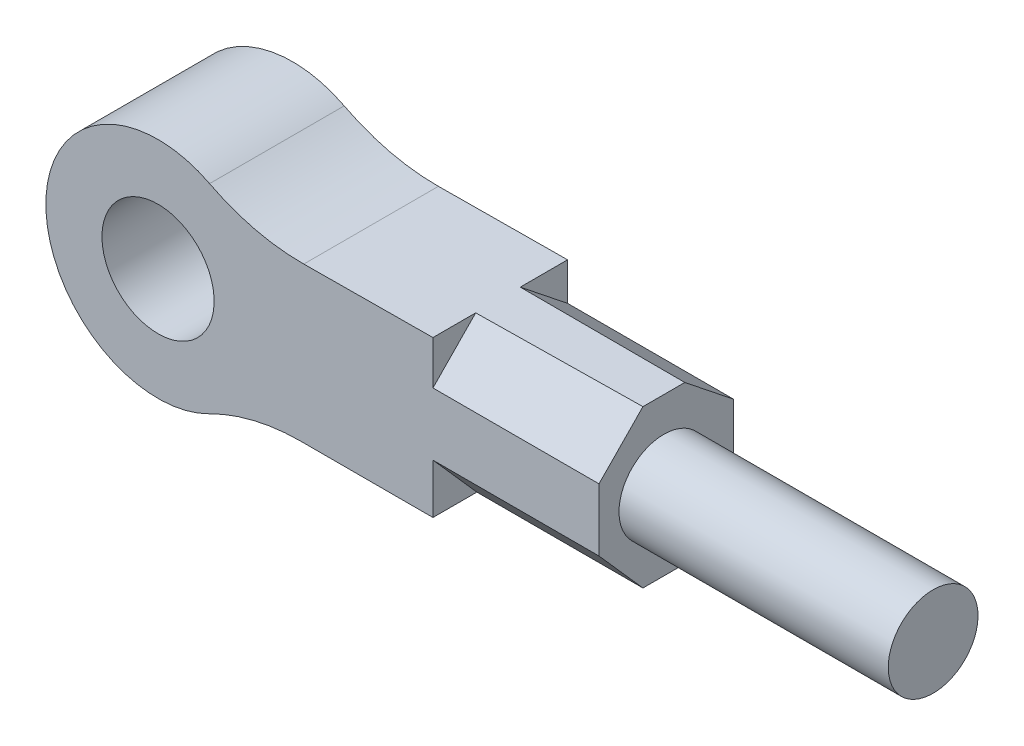
ISO-10303-21;
HEADER;
FILE_DESCRIPTION(('STEP AP214'),'2;1');
FILE_NAME('part.step','',(''),(''),'','','');
FILE_SCHEMA(('AUTOMOTIVE_DESIGN { 1 0 10303 214 1 1 1 1 }'));
ENDSEC;
DATA;
#1=APPLICATION_CONTEXT('core data for automotive mechanical design processes');
#2=APPLICATION_PROTOCOL_DEFINITION('international standard','automotive_design',2000,#1);
#3=PRODUCT_CONTEXT('',#1,'mechanical');
#4=PRODUCT('Part','Part','',(#3));
#5=PRODUCT_RELATED_PRODUCT_CATEGORY('part','',(#4));
#6=PRODUCT_DEFINITION_FORMATION('','',#4);
#7=PRODUCT_DEFINITION_CONTEXT('part definition',#1,'design');
#8=PRODUCT_DEFINITION('design','',#6,#7);
#9=PRODUCT_DEFINITION_SHAPE('','',#8);
#10=(LENGTH_UNIT() NAMED_UNIT(*) SI_UNIT(.MILLI.,.METRE.));
#11=(NAMED_UNIT(*) PLANE_ANGLE_UNIT() SI_UNIT($,.RADIAN.));
#12=(NAMED_UNIT(*) SI_UNIT($,.STERADIAN.) SOLID_ANGLE_UNIT());
#13=UNCERTAINTY_MEASURE_WITH_UNIT(LENGTH_MEASURE(1.E-05),#10,'distance_accuracy_value','');
#14=(GEOMETRIC_REPRESENTATION_CONTEXT(3) GLOBAL_UNCERTAINTY_ASSIGNED_CONTEXT((#13)) GLOBAL_UNIT_ASSIGNED_CONTEXT((#10,
#11,#12)) REPRESENTATION_CONTEXT('',''));
#15=CARTESIAN_POINT('',(0.,0.,0.));
#16=DIRECTION('',(0.,0.,1.));
#17=DIRECTION('',(1.,0.,0.));
#18=AXIS2_PLACEMENT_3D('',#15,#16,#17);
#19=CARTESIAN_POINT('',(0.,-34.6739639058458,60.));
#20=DIRECTION('',(0.,1.,0.));
#21=DIRECTION('',(0.,0.,1.));
#22=AXIS2_PLACEMENT_3D('',#19,#20,#21);
#23=PLANE('',#22);
#24=DIRECTION('',(0.999999998559959,0.,-5.36663966134042E-05));
#25=VECTOR('',#24,1.);
#26=CARTESIAN_POINT('',(-0.00105023967818376,-34.6739639058458,40.4302181076742));
#27=LINE('',#26,#25);
#28=CARTESIAN_POINT('',(122.511673572301,-34.6739639058458,40.4236432912385));
#29=VERTEX_POINT('',#28);
#30=CARTESIAN_POINT('',(196.511673708677,-34.6739639058458,40.419671977876));
#31=VERTEX_POINT('',#30);
#32=EDGE_CURVE('E205',#29,#31,#27,.T.);
#33=ORIENTED_EDGE('',*,*,#32,.F.);
#34=DIRECTION('',(0.,0.,-1.));
#35=VECTOR('',#34,1.);
#36=CARTESIAN_POINT('',(122.511673572301,-34.6739639058458,60.));
#37=LINE('',#36,#35);
#38=CARTESIAN_POINT('',(122.511673572301,-34.6739639058458,60.));
#39=VERTEX_POINT('',#38);
#40=EDGE_CURVE('E203',#39,#29,#37,.T.);
#41=ORIENTED_EDGE('',*,*,#40,.F.);
#42=DIRECTION('',(1.,0.,0.));
#43=VECTOR('',#42,1.);
#44=CARTESIAN_POINT('',(0.,-34.6739639058458,60.));
#45=LINE('',#44,#43);
#46=CARTESIAN_POINT('',(63.6898949913082,-34.6739639058458,60.));
#47=VERTEX_POINT('',#46);
#48=EDGE_CURVE('E217',#47,#39,#45,.T.);
#49=ORIENTED_EDGE('',*,*,#48,.F.);
#50=DIRECTION('',(0.,0.,-1.));
#51=VECTOR('',#50,1.);
#52=CARTESIAN_POINT('',(63.6898949913082,-34.6739639058458,60.));
#53=LINE('',#52,#51);
#54=CARTESIAN_POINT('',(63.6898949913082,-34.6739639058458,0.));
#55=VERTEX_POINT('',#54);
#56=EDGE_CURVE('E253',#47,#55,#53,.T.);
#57=ORIENTED_EDGE('',*,*,#56,.T.);
#58=DIRECTION('',(1.,0.,0.));
#59=VECTOR('',#58,1.);
#60=CARTESIAN_POINT('',(0.,-34.6739639058458,0.));
#61=LINE('',#60,#59);
#62=CARTESIAN_POINT('',(122.511673572301,-34.6739639058458,0.));
#63=VERTEX_POINT('',#62);
#64=EDGE_CURVE('E236',#55,#63,#61,.T.);
#65=ORIENTED_EDGE('',*,*,#64,.T.);
#66=DIRECTION('',(0.,0.,-1.));
#67=VECTOR('',#66,1.);
#68=CARTESIAN_POINT('',(122.511673572301,-34.6739639058458,60.));
#69=LINE('',#68,#67);
#70=CARTESIAN_POINT('',(122.511673572301,-34.6739639058458,18.4861965025552));
#71=VERTEX_POINT('',#70);
#72=EDGE_CURVE('E143',#71,#63,#69,.T.);
#73=ORIENTED_EDGE('',*,*,#72,.F.);
#74=DIRECTION('',(-0.999999998157082,0.,-6.0711079798287E-05));
#75=VECTOR('',#74,1.);
#76=CARTESIAN_POINT('',(0.00252079939005911,-34.6739639058458,18.4787588395914));
#77=LINE('',#76,#75);
#78=CARTESIAN_POINT('',(196.511673708677,-34.6739639058458,18.4906891224768));
#79=VERTEX_POINT('',#78);
#80=EDGE_CURVE('E154',#79,#71,#77,.T.);
#81=ORIENTED_EDGE('',*,*,#80,.F.);
#82=DIRECTION('',(0.,0.,-1.));
#83=VECTOR('',#82,1.);
#84=CARTESIAN_POINT('',(196.511673708677,-34.6739639058458,60.));
#85=LINE('',#84,#83);
#86=EDGE_CURVE('E250',#31,#79,#85,.T.);
#87=ORIENTED_EDGE('',*,*,#86,.F.);
#88=EDGE_LOOP('',(#33,#41,#49,#57,#65,#73,#81,#87));
#89=FACE_BOUND('',#88,.T.);
#90=ADVANCED_FACE('F35',(#89),#23,.F.);
#91=CARTESIAN_POINT('',(196.509567890578,0.011930308101305,60.));
#92=DIRECTION('',(0.999999998157082,6.07110799101727E-05,0.));
#93=DIRECTION('',(-6.07110799101727E-05,0.999999998157083,0.));
#94=AXIS2_PLACEMENT_3D('',#91,#92,#93);
#95=PLANE('',#94);
#96=CARTESIAN_POINT('',(196.509567890578,0.011930308101305,31.0896388996472));
#97=DIRECTION('',(0.999999998157082,6.07110799101727E-05,0.));
#98=DIRECTION('',(-6.07110799101727E-05,0.999999998157082,0.));
#99=AXIS2_PLACEMENT_3D('',#96,#97,#98);
#100=CIRCLE('',#99,20.);
#101=CARTESIAN_POINT('',(196.50835366898,20.011930271243,31.0896388996472));
#102=VERTEX_POINT('',#101);
#103=EDGE_CURVE('E11',#102,#102,#100,.T.);
#104=ORIENTED_EDGE('',*,*,#103,.F.);
#105=EDGE_LOOP('',(#104));
#106=FACE_BOUND('',#105,.T.);
#107=DIRECTION('',(3.78351369634586E-05,-0.623199866476116,-0.782062609381534));
#108=VECTOR('',#107,1.);
#109=CARTESIAN_POINT('',(196.508900453848,11.0055863176969,-8.76048145037248));
#110=LINE('',#109,#108);
#111=CARTESIAN_POINT('',(196.507423933084,35.32603596515,21.7596058214183));
#112=VERTEX_POINT('',#111);
#113=CARTESIAN_POINT('',(196.508476633541,17.9865246781896,0.));
#114=VERTEX_POINT('',#113);
#115=EDGE_CURVE('E173',#112,#114,#110,.T.);
#116=ORIENTED_EDGE('',*,*,#115,.F.);
#117=DIRECTION('',(0.,0.,-1.));
#118=VECTOR('',#117,1.);
#119=CARTESIAN_POINT('',(196.507423933083,35.32603596515,60.));
#120=LINE('',#119,#118);
#121=CARTESIAN_POINT('',(196.507423933084,35.32603596515,40.419671977876));
#122=VERTEX_POINT('',#121);
#123=EDGE_CURVE('E247',#122,#112,#120,.T.);
#124=ORIENTED_EDGE('',*,*,#123,.F.);
#125=DIRECTION('',(4.33819581567323E-05,-0.714564098365161,0.699569973230405));
#126=VECTOR('',#125,1.);
#127=CARTESIAN_POINT('',(196.507291956634,37.4998804943688,38.2914425263937));
#128=LINE('',#127,#126);
#129=CARTESIAN_POINT('',(196.508638154682,15.3260360020083,60.));
#130=VERTEX_POINT('',#129);
#131=EDGE_CURVE('E179',#122,#130,#128,.T.);
#132=ORIENTED_EDGE('',*,*,#131,.T.);
#133=DIRECTION('',(6.07110799101727E-05,-0.999999998157082,0.));
#134=VECTOR('',#133,1.);
#135=CARTESIAN_POINT('',(196.509567890578,0.011930308101305,60.));
#136=LINE('',#135,#134);
#137=CARTESIAN_POINT('',(196.510328921861,-12.5233644557039,60.));
#138=VERTEX_POINT('',#137);
#139=EDGE_CURVE('E220',#130,#138,#136,.T.);
#140=ORIENTED_EDGE('',*,*,#139,.T.);
#141=DIRECTION('',(4.54870958576141E-05,-0.749238785424287,-0.662299962514617));
#142=VECTOR('',#141,1.);
#143=CARTESIAN_POINT('',(196.511709276397,-35.2598161052679,39.9017998424972));
#144=LINE('',#143,#142);
#145=EDGE_CURVE('E163',#138,#31,#144,.T.);
#146=ORIENTED_EDGE('',*,*,#145,.T.);
#147=ORIENTED_EDGE('',*,*,#86,.T.);
#148=DIRECTION('',(-4.29292162976357E-05,0.707106779883409,-0.707106781186546));
#149=VECTOR('',#148,1.);
#150=CARTESIAN_POINT('',(196.510059504775,-8.08567225467219,-8.09760257769674));
#151=LINE('',#150,#149);
#152=CARTESIAN_POINT('',(196.510551118972,-16.1832748174458,0.));
#153=VERTEX_POINT('',#152);
#154=EDGE_CURVE('E155',#79,#153,#151,.T.);
#155=ORIENTED_EDGE('',*,*,#154,.T.);
#156=DIRECTION('',(6.07110799101727E-05,-0.999999998157082,0.));
#157=VECTOR('',#156,1.);
#158=CARTESIAN_POINT('',(196.509567890578,0.011930308101305,0.));
#159=LINE('',#158,#157);
#160=EDGE_CURVE('E162',#114,#153,#159,.T.);
#161=ORIENTED_EDGE('',*,*,#160,.F.);
#162=EDGE_LOOP('',(#116,#124,#132,#140,#146,#147,#155,#161));
#163=FACE_BOUND('',#162,.T.);
#164=ADVANCED_FACE('F290',(#106,#163),#95,.T.);
#165=CARTESIAN_POINT('',(-0.247026407184308,33.8919630896264,60.));
#166=DIRECTION('',(-0.00728844904140236,0.999973438902539,0.));
#167=DIRECTION('',(-0.99997343890254,-0.00728844904140236,0.));
#168=AXIS2_PLACEMENT_3D('',#165,#166,#167);
#169=PLANE('',#168);
#170=DIRECTION('',(0.999932308306415,0.00728814925518582,0.00906982278980949));
#171=VECTOR('',#170,1.);
#172=CARTESIAN_POINT('',(0.115969066376734,33.8946088339116,19.9782495453212));
#173=LINE('',#172,#171);
#174=CARTESIAN_POINT('',(122.507456541794,34.7866766477778,21.0883937952489));
#175=VERTEX_POINT('',#174);
#176=EDGE_CURVE('E197',#175,#112,#173,.T.);
#177=ORIENTED_EDGE('',*,*,#176,.F.);
#178=DIRECTION('',(0.,0.,-1.));
#179=VECTOR('',#178,1.);
#180=CARTESIAN_POINT('',(122.507456541794,34.7866766477777,60.));
#181=LINE('',#180,#179);
#182=CARTESIAN_POINT('',(122.507456541794,34.7866766477777,0.));
#183=VERTEX_POINT('',#182);
#184=EDGE_CURVE('E194',#175,#183,#181,.T.);
#185=ORIENTED_EDGE('',*,*,#184,.T.);
#186=DIRECTION('',(0.99997343890254,0.00728844904140236,0.));
#187=VECTOR('',#186,1.);
#188=CARTESIAN_POINT('',(-0.247026407184308,33.8919630896264,0.));
#189=LINE('',#188,#187);
#190=CARTESIAN_POINT('',(64.9475486896938,34.3671430492971,0.));
#191=VERTEX_POINT('',#190);
#192=EDGE_CURVE('E239',#191,#183,#189,.T.);
#193=ORIENTED_EDGE('',*,*,#192,.F.);
#194=DIRECTION('',(0.,0.,-1.));
#195=VECTOR('',#194,1.);
#196=CARTESIAN_POINT('',(64.9475486896938,34.3671430492971,60.));
#197=LINE('',#196,#195);
#198=CARTESIAN_POINT('',(64.9475486896938,34.3671430492971,60.));
#199=VERTEX_POINT('',#198);
#200=EDGE_CURVE('E245',#199,#191,#197,.T.);
#201=ORIENTED_EDGE('',*,*,#200,.F.);
#202=DIRECTION('',(0.99997343890254,0.00728844904140236,0.));
#203=VECTOR('',#202,1.);
#204=CARTESIAN_POINT('',(-0.247026407184308,33.8919630896264,60.));
#205=LINE('',#204,#203);
#206=CARTESIAN_POINT('',(122.507456541794,34.7866766477777,60.));
#207=VERTEX_POINT('',#206);
#208=EDGE_CURVE('E223',#199,#207,#205,.T.);
#209=ORIENTED_EDGE('',*,*,#208,.T.);
#210=DIRECTION('',(0.,0.,-1.));
#211=VECTOR('',#210,1.);
#212=CARTESIAN_POINT('',(122.507456541794,34.7866766477777,60.));
#213=LINE('',#212,#211);
#214=CARTESIAN_POINT('',(122.507456541794,34.7866766477777,40.9433152480589));
#215=VERTEX_POINT('',#214);
#216=EDGE_CURVE('E59',#207,#215,#213,.T.);
#217=ORIENTED_EDGE('',*,*,#216,.T.);
#218=DIRECTION('',(0.999948405084847,0.00728826657885139,-0.00707589842687326));
#219=VECTOR('',#218,1.);
#220=CARTESIAN_POINT('',(-0.375716502609793,33.8910251135101,41.8128689634431));
#221=LINE('',#220,#219);
#222=EDGE_CURVE('E200',#215,#122,#221,.T.);
#223=ORIENTED_EDGE('',*,*,#222,.T.);
#224=ORIENTED_EDGE('',*,*,#123,.T.);
#225=EDGE_LOOP('',(#177,#185,#193,#201,#209,#217,#223,#224));
#226=FACE_BOUND('',#225,.T.);
#227=ADVANCED_FACE('F281',(#226),#169,.T.);
#228=CARTESIAN_POINT('',(0.,0.,60.));
#229=DIRECTION('',(0.,0.,1.));
#230=DIRECTION('',(1.,0.,0.));
#231=AXIS2_PLACEMENT_3D('',#228,#229,#230);
#232=PLANE('',#231);
#233=CARTESIAN_POINT('',(0.,0.,60.));
#234=DIRECTION('',(0.,0.,1.));
#235=DIRECTION('',(1.,0.,0.));
#236=AXIS2_PLACEMENT_3D('',#233,#234,#235);
#237=CIRCLE('',#236,25.);
#238=CARTESIAN_POINT('',(-25.,0.,60.));
#239=VERTEX_POINT('',#238);
#240=EDGE_CURVE('E208',#239,#239,#237,.T.);
#241=ORIENTED_EDGE('',*,*,#240,.F.);
#242=EDGE_LOOP('',(#241));
#243=FACE_BOUND('',#242,.T.);
#244=DIRECTION('',(6.0711079910233E-05,-0.999999998157083,0.));
#245=VECTOR('',#244,1.);
#246=CARTESIAN_POINT('',(122.509568026954,0.00743768818796402,60.));
#247=LINE('',#246,#245);
#248=CARTESIAN_POINT('',(122.510329058237,-12.5278570756172,60.));
#249=VERTEX_POINT('',#248);
#250=EDGE_CURVE('E181',#249,#39,#247,.T.);
#251=ORIENTED_EDGE('',*,*,#250,.F.);
#252=DIRECTION('',(0.999999998157082,6.07110799101727E-05,0.));
#253=VECTOR('',#252,1.);
#254=CARTESIAN_POINT('',(122.510329058237,-12.5278570756172,60.));
#255=LINE('',#254,#253);
#256=EDGE_CURVE('E177',#249,#138,#255,.T.);
#257=ORIENTED_EDGE('',*,*,#256,.T.);
#258=ORIENTED_EDGE('',*,*,#139,.F.);
#259=DIRECTION('',(0.999999998157082,6.07110799101727E-05,0.));
#260=VECTOR('',#259,1.);
#261=CARTESIAN_POINT('',(122.508638291058,15.321543382095,60.));
#262=LINE('',#261,#260);
#263=CARTESIAN_POINT('',(122.508638291058,15.321543382095,60.));
#264=VERTEX_POINT('',#263);
#265=EDGE_CURVE('E188',#264,#130,#262,.T.);
#266=ORIENTED_EDGE('',*,*,#265,.F.);
#267=DIRECTION('',(-6.0711079910233E-05,0.999999998157083,0.));
#268=VECTOR('',#267,1.);
#269=CARTESIAN_POINT('',(122.509568026954,0.00743768818795956,60.));
#270=LINE('',#269,#268);
#271=EDGE_CURVE('E39',#264,#207,#270,.T.);
#272=ORIENTED_EDGE('',*,*,#271,.T.);
#273=ORIENTED_EDGE('',*,*,#208,.F.);
#274=CARTESIAN_POINT('',(64.2915882759676,124.364752550526,60.));
#275=DIRECTION('',(0.,0.,1.));
#276=DIRECTION('',(1.,0.,0.));
#277=AXIS2_PLACEMENT_3D('',#274,#275,#276);
#278=CIRCLE('',#277,90.);
#279=CARTESIAN_POINT('',(22.9612815271313,44.4159830537592,60.));
#280=VERTEX_POINT('',#279);
#281=EDGE_CURVE('E226',#199,#280,#278,.F.);
#282=ORIENTED_EDGE('',*,*,#281,.T.);
#283=CARTESIAN_POINT('',(0.,0.,60.));
#284=DIRECTION('',(0.,0.,1.));
#285=DIRECTION('',(1.,0.,0.));
#286=AXIS2_PLACEMENT_3D('',#283,#284,#285);
#287=CIRCLE('',#286,50.);
#288=CARTESIAN_POINT('',(22.7463910683243,-44.5264156806592,60.));
#289=VERTEX_POINT('',#288);
#290=EDGE_CURVE('E211',#280,#289,#287,.T.);
#291=ORIENTED_EDGE('',*,*,#290,.T.);
#292=CARTESIAN_POINT('',(63.6898949913082,-124.673963905846,60.));
#293=DIRECTION('',(0.,0.,1.));
#294=DIRECTION('',(1.,0.,0.));
#295=AXIS2_PLACEMENT_3D('',#292,#293,#294);
#296=CIRCLE('',#295,90.);
#297=EDGE_CURVE('E215',#289,#47,#296,.F.);
#298=ORIENTED_EDGE('',*,*,#297,.T.);
#299=ORIENTED_EDGE('',*,*,#48,.T.);
#300=EDGE_LOOP('',(#251,#257,#258,#266,#272,#273,#282,#291,#298,#299));
#301=FACE_BOUND('',#300,.T.);
#302=ADVANCED_FACE('F274',(#243,#301),#232,.T.);
#303=CARTESIAN_POINT('',(0.,0.,0.));
#304=DIRECTION('',(0.,0.,1.));
#305=DIRECTION('',(1.,0.,0.));
#306=AXIS2_PLACEMENT_3D('',#303,#304,#305);
#307=PLANE('',#306);
#308=CARTESIAN_POINT('',(0.,0.,0.));
#309=DIRECTION('',(0.,0.,1.));
#310=DIRECTION('',(1.,0.,0.));
#311=AXIS2_PLACEMENT_3D('',#308,#309,#310);
#312=CIRCLE('',#311,25.);
#313=CARTESIAN_POINT('',(-25.,0.,0.));
#314=VERTEX_POINT('',#313);
#315=EDGE_CURVE('E207',#314,#314,#312,.T.);
#316=ORIENTED_EDGE('',*,*,#315,.T.);
#317=EDGE_LOOP('',(#316));
#318=FACE_BOUND('',#317,.T.);
#319=DIRECTION('',(-6.0711079910233E-05,0.999999998157083,0.));
#320=VECTOR('',#319,1.);
#321=CARTESIAN_POINT('',(122.509568026954,0.00743768818796402,0.));
#322=LINE('',#321,#320);
#323=CARTESIAN_POINT('',(122.508476769917,17.9820320582763,0.));
#324=VERTEX_POINT('',#323);
#325=EDGE_CURVE('E172',#324,#183,#322,.T.);
#326=ORIENTED_EDGE('',*,*,#325,.F.);
#327=DIRECTION('',(0.999999998157082,6.07110799101727E-05,0.));
#328=VECTOR('',#327,1.);
#329=CARTESIAN_POINT('',(122.508476769917,17.9820320582763,0.));
#330=LINE('',#329,#328);
#331=EDGE_CURVE('E175',#324,#114,#330,.T.);
#332=ORIENTED_EDGE('',*,*,#331,.T.);
#333=ORIENTED_EDGE('',*,*,#160,.T.);
#334=DIRECTION('',(0.999999998157082,6.07110799101727E-05,0.));
#335=VECTOR('',#334,1.);
#336=CARTESIAN_POINT('',(122.510551255348,-16.1877674373591,0.));
#337=LINE('',#336,#335);
#338=CARTESIAN_POINT('',(122.510551255348,-16.1877674373591,0.));
#339=VERTEX_POINT('',#338);
#340=EDGE_CURVE('E151',#339,#153,#337,.T.);
#341=ORIENTED_EDGE('',*,*,#340,.F.);
#342=DIRECTION('',(-6.0711079910233E-05,0.999999998157083,0.));
#343=VECTOR('',#342,1.);
#344=CARTESIAN_POINT('',(122.509568026954,0.00743768818795956,0.));
#345=LINE('',#344,#343);
#346=EDGE_CURVE('E138',#63,#339,#345,.T.);
#347=ORIENTED_EDGE('',*,*,#346,.F.);
#348=ORIENTED_EDGE('',*,*,#64,.F.);
#349=CARTESIAN_POINT('',(63.6898949913082,-124.673963905846,0.));
#350=DIRECTION('',(0.,0.,1.));
#351=DIRECTION('',(1.,0.,0.));
#352=AXIS2_PLACEMENT_3D('',#349,#350,#351);
#353=CIRCLE('',#352,90.);
#354=CARTESIAN_POINT('',(22.7463910683243,-44.5264156806592,0.));
#355=VERTEX_POINT('',#354);
#356=EDGE_CURVE('E234',#355,#55,#353,.F.);
#357=ORIENTED_EDGE('',*,*,#356,.F.);
#358=CARTESIAN_POINT('',(0.,0.,0.));
#359=DIRECTION('',(0.,0.,1.));
#360=DIRECTION('',(1.,0.,0.));
#361=AXIS2_PLACEMENT_3D('',#358,#359,#360);
#362=CIRCLE('',#361,50.);
#363=CARTESIAN_POINT('',(22.9612815271313,44.4159830537592,0.));
#364=VERTEX_POINT('',#363);
#365=EDGE_CURVE('E231',#364,#355,#362,.T.);
#366=ORIENTED_EDGE('',*,*,#365,.F.);
#367=CARTESIAN_POINT('',(64.2915882759676,124.364752550526,0.));
#368=DIRECTION('',(0.,0.,1.));
#369=DIRECTION('',(1.,0.,0.));
#370=AXIS2_PLACEMENT_3D('',#367,#368,#369);
#371=CIRCLE('',#370,90.);
#372=EDGE_CURVE('E212',#191,#364,#371,.F.);
#373=ORIENTED_EDGE('',*,*,#372,.F.);
#374=ORIENTED_EDGE('',*,*,#192,.T.);
#375=EDGE_LOOP('',(#326,#332,#333,#341,#347,#348,#357,#366,#373,#374));
#376=FACE_BOUND('',#375,.T.);
#377=ADVANCED_FACE('F159',(#318,#376),#307,.F.);
#378=CARTESIAN_POINT('',(0.,0.,60.));
#379=DIRECTION('',(0.,0.,-1.));
#380=DIRECTION('',(-1.,0.,0.));
#381=AXIS2_PLACEMENT_3D('',#378,#379,#380);
#382=CYLINDRICAL_SURFACE('',#381,50.);
#383=ORIENTED_EDGE('',*,*,#365,.T.);
#384=DIRECTION('',(0.,0.,-1.));
#385=VECTOR('',#384,1.);
#386=CARTESIAN_POINT('',(22.7463910683243,-44.5264156806592,60.));
#387=LINE('',#386,#385);
#388=EDGE_CURVE('E148',#289,#355,#387,.T.);
#389=ORIENTED_EDGE('',*,*,#388,.F.);
#390=ORIENTED_EDGE('',*,*,#290,.F.);
#391=DIRECTION('',(0.,0.,-1.));
#392=VECTOR('',#391,1.);
#393=CARTESIAN_POINT('',(22.9612815271313,44.4159830537592,60.));
#394=LINE('',#393,#392);
#395=EDGE_CURVE('E228',#280,#364,#394,.T.);
#396=ORIENTED_EDGE('',*,*,#395,.T.);
#397=EDGE_LOOP('',(#383,#389,#390,#396));
#398=FACE_BOUND('',#397,.T.);
#399=ADVANCED_FACE('F264',(#398),#382,.T.);
#400=CARTESIAN_POINT('',(63.6898949913082,-124.673963905846,60.));
#401=DIRECTION('',(0.,0.,-1.));
#402=DIRECTION('',(-1.,0.,0.));
#403=AXIS2_PLACEMENT_3D('',#400,#401,#402);
#404=CYLINDRICAL_SURFACE('',#403,90.);
#405=ORIENTED_EDGE('',*,*,#356,.T.);
#406=ORIENTED_EDGE('',*,*,#56,.F.);
#407=ORIENTED_EDGE('',*,*,#297,.F.);
#408=ORIENTED_EDGE('',*,*,#388,.T.);
#409=EDGE_LOOP('',(#405,#406,#407,#408));
#410=FACE_BOUND('',#409,.T.);
#411=ADVANCED_FACE('F259',(#410),#404,.F.);
#412=CARTESIAN_POINT('',(0.,0.,60.));
#413=DIRECTION('',(0.,0.,-1.));
#414=DIRECTION('',(-1.,0.,0.));
#415=AXIS2_PLACEMENT_3D('',#412,#413,#414);
#416=CYLINDRICAL_SURFACE('',#415,25.);
#417=CARTESIAN_POINT('',(-25.,0.,60.));
#418=CARTESIAN_POINT('',(-25.,0.,59.375));
#419=CARTESIAN_POINT('',(-25.,0.,58.75));
#420=CARTESIAN_POINT('',(-25.,0.,57.5));
#421=CARTESIAN_POINT('',(-25.,0.,56.875));
#422=CARTESIAN_POINT('',(-25.,0.,55.625));
#423=CARTESIAN_POINT('',(-25.,0.,55.));
#424=CARTESIAN_POINT('',(-25.,0.,53.75));
#425=CARTESIAN_POINT('',(-25.,0.,53.125));
#426=CARTESIAN_POINT('',(-25.,0.,51.875));
#427=CARTESIAN_POINT('',(-25.,0.,51.25));
#428=CARTESIAN_POINT('',(-25.,0.,50.));
#429=CARTESIAN_POINT('',(-25.,0.,49.375));
#430=CARTESIAN_POINT('',(-25.,0.,48.125));
#431=CARTESIAN_POINT('',(-25.,0.,47.5));
#432=CARTESIAN_POINT('',(-25.,0.,46.25));
#433=CARTESIAN_POINT('',(-25.,0.,45.625));
#434=CARTESIAN_POINT('',(-25.,0.,44.375));
#435=CARTESIAN_POINT('',(-25.,0.,43.75));
#436=CARTESIAN_POINT('',(-25.,0.,42.5));
#437=CARTESIAN_POINT('',(-25.,0.,41.875));
#438=CARTESIAN_POINT('',(-25.,0.,40.625));
#439=CARTESIAN_POINT('',(-25.,0.,40.));
#440=CARTESIAN_POINT('',(-25.,0.,38.75));
#441=CARTESIAN_POINT('',(-25.,0.,38.125));
#442=CARTESIAN_POINT('',(-25.,0.,36.875));
#443=CARTESIAN_POINT('',(-25.,0.,36.25));
#444=CARTESIAN_POINT('',(-25.,0.,35.));
#445=CARTESIAN_POINT('',(-25.,0.,34.375));
#446=CARTESIAN_POINT('',(-25.,0.,33.125));
#447=CARTESIAN_POINT('',(-25.,0.,32.5));
#448=CARTESIAN_POINT('',(-25.,0.,31.25));
#449=CARTESIAN_POINT('',(-25.,0.,30.625));
#450=CARTESIAN_POINT('',(-25.,0.,29.375));
#451=CARTESIAN_POINT('',(-25.,0.,28.75));
#452=CARTESIAN_POINT('',(-25.,0.,27.5));
#453=CARTESIAN_POINT('',(-25.,0.,26.875));
#454=CARTESIAN_POINT('',(-25.,0.,25.625));
#455=CARTESIAN_POINT('',(-25.,0.,25.));
#456=CARTESIAN_POINT('',(-25.,0.,23.75));
#457=CARTESIAN_POINT('',(-25.,0.,23.125));
#458=CARTESIAN_POINT('',(-25.,0.,21.875));
#459=CARTESIAN_POINT('',(-25.,0.,21.25));
#460=CARTESIAN_POINT('',(-25.,0.,20.));
#461=CARTESIAN_POINT('',(-25.,0.,19.375));
#462=CARTESIAN_POINT('',(-25.,0.,18.125));
#463=CARTESIAN_POINT('',(-25.,0.,17.5));
#464=CARTESIAN_POINT('',(-25.,0.,16.25));
#465=CARTESIAN_POINT('',(-25.,0.,15.625));
#466=CARTESIAN_POINT('',(-25.,0.,14.375));
#467=CARTESIAN_POINT('',(-25.,0.,13.75));
#468=CARTESIAN_POINT('',(-25.,0.,12.5));
#469=CARTESIAN_POINT('',(-25.,0.,11.875));
#470=CARTESIAN_POINT('',(-25.,0.,10.625));
#471=CARTESIAN_POINT('',(-25.,0.,10.));
#472=CARTESIAN_POINT('',(-25.,0.,8.75));
#473=CARTESIAN_POINT('',(-25.,0.,8.125));
#474=CARTESIAN_POINT('',(-25.,0.,6.875));
#475=CARTESIAN_POINT('',(-25.,0.,6.25));
#476=CARTESIAN_POINT('',(-25.,0.,5.));
#477=CARTESIAN_POINT('',(-25.,0.,4.375));
#478=CARTESIAN_POINT('',(-25.,0.,3.125));
#479=CARTESIAN_POINT('',(-25.,0.,2.5));
#480=CARTESIAN_POINT('',(-25.,0.,1.25));
#481=CARTESIAN_POINT('',(-25.,0.,0.625000000000001));
#482=CARTESIAN_POINT('',(-25.,0.,0.));
#483=B_SPLINE_CURVE_WITH_KNOTS('',3,(#417,#418,#419,#420,#421,#422,#423,#424,#425,#426,#427,
#428,#429,#430,#431,#432,#433,#434,#435,#436,#437,#438,#439,#440,#441,#442,#443,#444,#445,#446,
#447,#448,#449,#450,#451,#452,#453,#454,#455,#456,#457,#458,#459,#460,#461,#462,#463,#464,#465,
#466,#467,#468,#469,#470,#471,#472,#473,#474,#475,#476,#477,#478,#479,#480,#481,#482),
.UNSPECIFIED.,.F.,.F.,(4,2,2,2,2,2,2,2,2,2,2,2,2,2,2,2,2,2,2,2,2,2,2,2,2,2,2,2,2,2,2,2,4),(0.,
1.87499999999999,3.75,5.625,7.49999999999999,9.37499999999999,11.25,13.125,15.,16.875,18.75,
20.625,22.5,24.375,26.25,28.125,30.,31.875,33.75,35.625,37.5,39.375,41.25,43.125,45.,46.875,
48.75,50.625,52.5,54.375,56.25,58.125,60.),.UNSPECIFIED.);
#484=EDGE_CURVE('BSEAM37',#239,#314,#483,.T.);
#485=ORIENTED_EDGE('',*,*,#240,.T.);
#486=ORIENTED_EDGE('',*,*,#315,.F.);
#487=ORIENTED_EDGE('',*,*,#484,.T.);
#488=ORIENTED_EDGE('',*,*,#484,.F.);
#489=EDGE_LOOP('',(#485,#487,#486,#488));
#490=FACE_BOUND('',#489,.T.);
#491=ADVANCED_FACE('F37',(#490),#416,.F.);
#492=CARTESIAN_POINT('',(64.2915882759676,124.364752550526,60.));
#493=DIRECTION('',(0.,0.,-1.));
#494=DIRECTION('',(-1.,0.,0.));
#495=AXIS2_PLACEMENT_3D('',#492,#493,#494);
#496=CYLINDRICAL_SURFACE('',#495,90.);
#497=ORIENTED_EDGE('',*,*,#372,.T.);
#498=ORIENTED_EDGE('',*,*,#395,.F.);
#499=ORIENTED_EDGE('',*,*,#281,.F.);
#500=ORIENTED_EDGE('',*,*,#200,.T.);
#501=EDGE_LOOP('',(#497,#498,#499,#500));
#502=FACE_BOUND('',#501,.T.);
#503=ADVANCED_FACE('F278',(#502),#496,.F.);
#504=CARTESIAN_POINT('',(122.510059641151,-8.09016487458555,-8.09760257769674));
#505=DIRECTION('',(4.29292162976414E-05,-0.707106779883407,-0.707106781186549));
#506=DIRECTION('',(0.,0.707106781838119,-0.707106780534976));
#507=AXIS2_PLACEMENT_3D('',#504,#505,#506);
#508=PLANE('',#507);
#509=ORIENTED_EDGE('',*,*,#80,.T.);
#510=DIRECTION('',(-4.29292162976357E-05,0.707106779883409,-0.707106781186546));
#511=VECTOR('',#510,1.);
#512=CARTESIAN_POINT('',(122.510059641151,-8.09016487458555,-8.09760257769674));
#513=LINE('',#512,#511);
#514=EDGE_CURVE('E141',#71,#339,#513,.T.);
#515=ORIENTED_EDGE('',*,*,#514,.T.);
#516=ORIENTED_EDGE('',*,*,#340,.T.);
#517=ORIENTED_EDGE('',*,*,#154,.F.);
#518=EDGE_LOOP('',(#509,#515,#516,#517));
#519=FACE_BOUND('',#518,.T.);
#520=ADVANCED_FACE('F150',(#519),#508,.T.);
#521=CARTESIAN_POINT('',(122.509568026954,0.00743768818796402,0.));
#522=DIRECTION('',(0.999999998157083,6.0711079910233E-05,0.));
#523=DIRECTION('',(-6.0711079910233E-05,0.999999998157083,0.));
#524=AXIS2_PLACEMENT_3D('',#521,#522,#523);
#525=PLANE('',#524);
#526=ORIENTED_EDGE('',*,*,#72,.T.);
#527=ORIENTED_EDGE('',*,*,#346,.T.);
#528=ORIENTED_EDGE('',*,*,#514,.F.);
#529=EDGE_LOOP('',(#526,#527,#528));
#530=FACE_BOUND('',#529,.T.);
#531=ADVANCED_FACE('F140',(#530),#525,.T.);
#532=CARTESIAN_POINT('',(122.508900590224,11.0010936977835,-8.76048145037248));
#533=DIRECTION('',(4.74798655729205E-05,-0.782062607940257,0.623199867624622));
#534=DIRECTION('',(0.,-0.623199868327073,-0.782062608821774));
#535=AXIS2_PLACEMENT_3D('',#532,#533,#534);
#536=PLANE('',#535);
#537=ORIENTED_EDGE('',*,*,#176,.T.);
#538=ORIENTED_EDGE('',*,*,#115,.T.);
#539=ORIENTED_EDGE('',*,*,#331,.F.);
#540=DIRECTION('',(3.78351369634586E-05,-0.623199866476116,-0.782062609381534));
#541=VECTOR('',#540,1.);
#542=CARTESIAN_POINT('',(122.508900590224,11.0010936977835,-8.76048145037248));
#543=LINE('',#542,#541);
#544=EDGE_CURVE('E169',#175,#324,#543,.T.);
#545=ORIENTED_EDGE('',*,*,#544,.F.);
#546=EDGE_LOOP('',(#537,#538,#539,#545));
#547=FACE_BOUND('',#546,.T.);
#548=ADVANCED_FACE('F286',(#547),#536,.F.);
#549=CARTESIAN_POINT('',(122.509568026954,0.00743768818796402,0.));
#550=DIRECTION('',(0.999999998157083,6.0711079910233E-05,0.));
#551=DIRECTION('',(-6.0711079910233E-05,0.999999998157083,0.));
#552=AXIS2_PLACEMENT_3D('',#549,#550,#551);
#553=PLANE('',#552);
#554=ORIENTED_EDGE('',*,*,#544,.T.);
#555=ORIENTED_EDGE('',*,*,#325,.T.);
#556=ORIENTED_EDGE('',*,*,#184,.F.);
#557=EDGE_LOOP('',(#554,#555,#556));
#558=FACE_BOUND('',#557,.T.);
#559=ADVANCED_FACE('F283',(#558),#553,.T.);
#560=CARTESIAN_POINT('',(122.50729209301,37.4953878744555,38.2914425263937));
#561=DIRECTION('',(-4.24716485475485E-05,0.699569971941155,0.714564099682044));
#562=DIRECTION('',(0.,-0.714564100326524,0.699569972572112));
#563=AXIS2_PLACEMENT_3D('',#560,#561,#562);
#564=PLANE('',#563);
#565=DIRECTION('',(4.33819581567323E-05,-0.714564098365161,0.699569973230405));
#566=VECTOR('',#565,1.);
#567=CARTESIAN_POINT('',(122.50729209301,37.4953878744555,38.2914425263937));
#568=LINE('',#567,#566);
#569=EDGE_CURVE('E185',#215,#264,#568,.T.);
#570=ORIENTED_EDGE('',*,*,#569,.T.);
#571=ORIENTED_EDGE('',*,*,#265,.T.);
#572=ORIENTED_EDGE('',*,*,#131,.F.);
#573=ORIENTED_EDGE('',*,*,#222,.F.);
#574=EDGE_LOOP('',(#570,#571,#572,#573));
#575=FACE_BOUND('',#574,.T.);
#576=ADVANCED_FACE('F416',(#575),#564,.T.);
#577=CARTESIAN_POINT('',(122.509568026954,0.00743768818796402,0.));
#578=DIRECTION('',(0.999999998157083,6.0711079910233E-05,0.));
#579=DIRECTION('',(-6.0711079910233E-05,0.999999998157083,0.));
#580=AXIS2_PLACEMENT_3D('',#577,#578,#579);
#581=PLANE('',#580);
#582=ORIENTED_EDGE('',*,*,#271,.F.);
#583=ORIENTED_EDGE('',*,*,#569,.F.);
#584=ORIENTED_EDGE('',*,*,#216,.F.);
#585=EDGE_LOOP('',(#582,#583,#584));
#586=FACE_BOUND('',#585,.T.);
#587=ADVANCED_FACE('F424',(#586),#581,.T.);
#588=CARTESIAN_POINT('',(122.511709412773,-35.2643087251813,39.9017998424972));
#589=DIRECTION('',(4.02089459487293E-05,-0.662299961294053,0.749238786805072));
#590=DIRECTION('',(0.,-0.749238787410742,-0.662299961829443));
#591=AXIS2_PLACEMENT_3D('',#588,#589,#590);
#592=PLANE('',#591);
#593=ORIENTED_EDGE('',*,*,#32,.T.);
#594=ORIENTED_EDGE('',*,*,#145,.F.);
#595=ORIENTED_EDGE('',*,*,#256,.F.);
#596=DIRECTION('',(4.54870958576141E-05,-0.749238785424287,-0.662299962514617));
#597=VECTOR('',#596,1.);
#598=CARTESIAN_POINT('',(122.511709412773,-35.2643087251813,39.9017998424972));
#599=LINE('',#598,#597);
#600=EDGE_CURVE('E51',#249,#29,#599,.T.);
#601=ORIENTED_EDGE('',*,*,#600,.T.);
#602=EDGE_LOOP('',(#593,#594,#595,#601));
#603=FACE_BOUND('',#602,.T.);
#604=ADVANCED_FACE('F432',(#603),#592,.T.);
#605=CARTESIAN_POINT('',(122.509568026954,0.00743768818796402,0.));
#606=DIRECTION('',(0.999999998157083,6.0711079910233E-05,0.));
#607=DIRECTION('',(-6.0711079910233E-05,0.999999998157083,0.));
#608=AXIS2_PLACEMENT_3D('',#605,#606,#607);
#609=PLANE('',#608);
#610=ORIENTED_EDGE('',*,*,#40,.T.);
#611=ORIENTED_EDGE('',*,*,#600,.F.);
#612=ORIENTED_EDGE('',*,*,#250,.T.);
#613=EDGE_LOOP('',(#610,#611,#612));
#614=FACE_BOUND('',#613,.T.);
#615=ADVANCED_FACE('F303',(#614),#609,.T.);
#616=CARTESIAN_POINT('',(316.509567669428,0.0192156376905257,31.0896388996472));
#617=DIRECTION('',(-0.999999998157083,-6.07110799101727E-05,0.));
#618=DIRECTION('',(6.07110799101727E-05,-0.999999998157083,0.));
#619=AXIS2_PLACEMENT_3D('',#616,#617,#618);
#620=CYLINDRICAL_SURFACE('',#619,20.);
#621=CARTESIAN_POINT('',(316.509567669428,0.0192156376905257,31.0896388996472));
#622=DIRECTION('',(0.999999998157082,6.07110799101727E-05,0.));
#623=DIRECTION('',(-6.07110799101727E-05,0.999999998157082,0.));
#624=AXIS2_PLACEMENT_3D('',#621,#622,#623);
#625=CIRCLE('',#624,20.);
#626=CARTESIAN_POINT('',(316.50835344783,20.0192156008322,31.0896388996472));
#627=VERTEX_POINT('',#626);
#628=EDGE_CURVE('E293',#627,#627,#625,.T.);
#629=ORIENTED_EDGE('',*,*,#628,.F.);
#630=EDGE_LOOP('',(#629));
#631=FACE_BOUND('',#630,.T.);
#632=ORIENTED_EDGE('',*,*,#103,.T.);
#633=EDGE_LOOP('',(#632));
#634=FACE_BOUND('',#633,.T.);
#635=ADVANCED_FACE('F300',(#631,#634),#620,.T.);
#636=CARTESIAN_POINT('',(316.509567669428,0.0192156376905257,31.0896388996472));
#637=DIRECTION('',(0.999999998157082,6.07110799101727E-05,0.));
#638=DIRECTION('',(-6.07110799101727E-05,0.999999998157082,0.));
#639=AXIS2_PLACEMENT_3D('',#636,#637,#638);
#640=PLANE('',#639);
#641=ORIENTED_EDGE('',*,*,#628,.T.);
#642=EDGE_LOOP('',(#641));
#643=FACE_BOUND('',#642,.T.);
#644=ADVANCED_FACE('F298',(#643),#640,.T.);
#645=CLOSED_SHELL('',(#90,#164,#227,#302,#377,#399,#411,#491,#503,#520,#531,#548,#559,#576,#587,
#604,#615,#635,#644));
#646=MANIFOLD_SOLID_BREP('B2',#645);
#647=ADVANCED_BREP_SHAPE_REPRESENTATION('',(#18,#646),#14);
#648=SHAPE_DEFINITION_REPRESENTATION(#9,#647);
ENDSEC;
END-ISO-10303-21;
